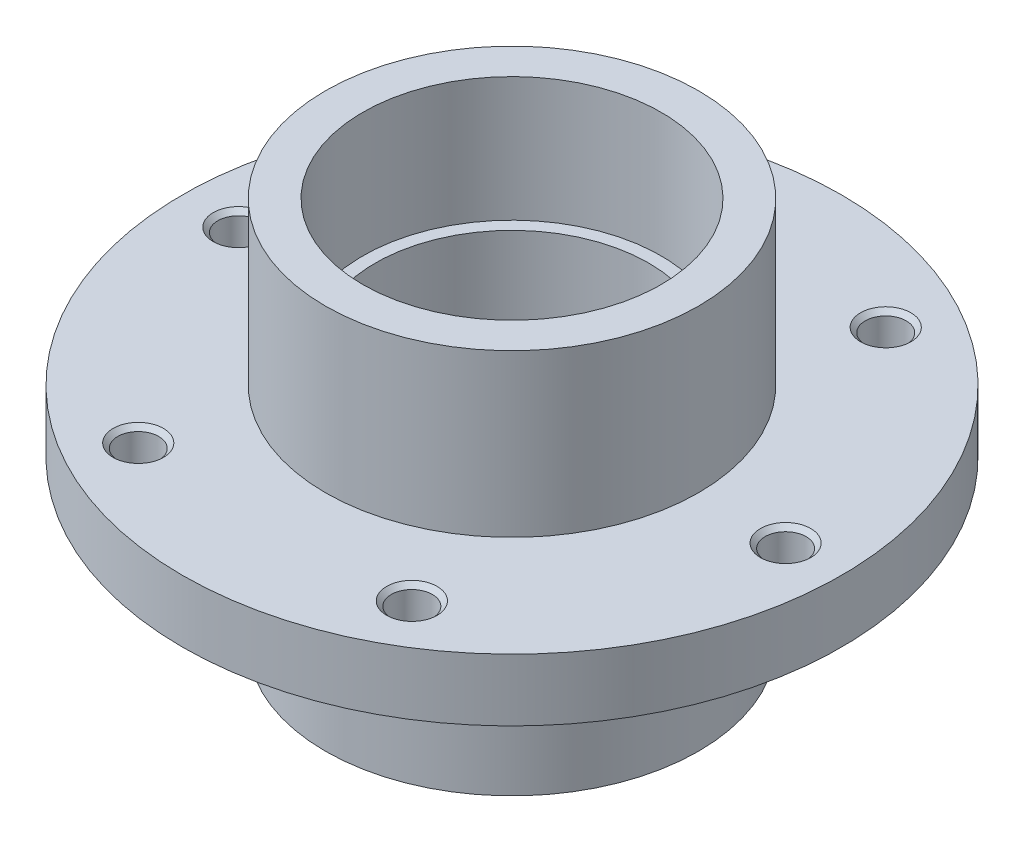
ISO-10303-21;
HEADER;
FILE_DESCRIPTION(('STEP AP214'),'2;1');
FILE_NAME('part.step','',(''),(''),'','','');
FILE_SCHEMA(('AUTOMOTIVE_DESIGN { 1 0 10303 214 1 1 1 1 }'));
ENDSEC;
DATA;
#1=APPLICATION_CONTEXT('core data for automotive mechanical design processes');
#2=APPLICATION_PROTOCOL_DEFINITION('international standard','automotive_design',2000,#1);
#3=PRODUCT_CONTEXT('',#1,'mechanical');
#4=PRODUCT('Part','Part','',(#3));
#5=PRODUCT_RELATED_PRODUCT_CATEGORY('part','',(#4));
#6=PRODUCT_DEFINITION_FORMATION('','',#4);
#7=PRODUCT_DEFINITION_CONTEXT('part definition',#1,'design');
#8=PRODUCT_DEFINITION('design','',#6,#7);
#9=PRODUCT_DEFINITION_SHAPE('','',#8);
#10=(LENGTH_UNIT() NAMED_UNIT(*) SI_UNIT(.MILLI.,.METRE.));
#11=(NAMED_UNIT(*) PLANE_ANGLE_UNIT() SI_UNIT($,.RADIAN.));
#12=(NAMED_UNIT(*) SI_UNIT($,.STERADIAN.) SOLID_ANGLE_UNIT());
#13=UNCERTAINTY_MEASURE_WITH_UNIT(LENGTH_MEASURE(1.E-05),#10,'distance_accuracy_value','');
#14=(GEOMETRIC_REPRESENTATION_CONTEXT(3) GLOBAL_UNCERTAINTY_ASSIGNED_CONTEXT((#13)) GLOBAL_UNIT_ASSIGNED_CONTEXT((#10,
#11,#12)) REPRESENTATION_CONTEXT('',''));
#15=CARTESIAN_POINT('',(0.,0.,0.));
#16=DIRECTION('',(0.,0.,1.));
#17=DIRECTION('',(1.,0.,0.));
#18=AXIS2_PLACEMENT_3D('',#15,#16,#17);
#19=CARTESIAN_POINT('',(0.,-44.1126983722081,0.));
#20=DIRECTION('',(0.,1.,0.));
#21=DIRECTION('',(0.,0.,1.));
#22=AXIS2_PLACEMENT_3D('',#19,#20,#21);
#23=CYLINDRICAL_SURFACE('',#22,11.);
#24=CARTESIAN_POINT('',(0.,8.,0.));
#25=DIRECTION('',(0.,1.,0.));
#26=DIRECTION('',(0.,0.,1.));
#27=AXIS2_PLACEMENT_3D('',#24,#25,#26);
#28=CIRCLE('',#27,11.);
#29=CARTESIAN_POINT('',(0.,8.,11.));
#30=VERTEX_POINT('',#29);
#31=EDGE_CURVE('E63',#30,#30,#28,.F.);
#32=ORIENTED_EDGE('',*,*,#31,.F.);
#33=EDGE_LOOP('',(#32));
#34=FACE_BOUND('',#33,.T.);
#35=CARTESIAN_POINT('',(0.,-3.,0.));
#36=DIRECTION('',(0.,-1.,0.));
#37=DIRECTION('',(0.,0.,-1.));
#38=AXIS2_PLACEMENT_3D('',#35,#36,#37);
#39=CIRCLE('',#38,11.);
#40=CARTESIAN_POINT('',(0.,-3.,-11.));
#41=VERTEX_POINT('',#40);
#42=EDGE_CURVE('E41',#41,#41,#39,.F.);
#43=ORIENTED_EDGE('',*,*,#42,.F.);
#44=EDGE_LOOP('',(#43));
#45=FACE_BOUND('',#44,.T.);
#46=ADVANCED_FACE('F37',(#34,#45),#23,.F.);
#47=CARTESIAN_POINT('',(0.,0.,0.));
#48=DIRECTION('',(0.,1.,0.));
#49=DIRECTION('',(0.,0.,1.));
#50=AXIS2_PLACEMENT_3D('',#47,#48,#49);
#51=PLANE('',#50);
#52=CARTESIAN_POINT('',(-11.0000000000001,0.,-19.0525588832576));
#53=DIRECTION('',(0.,1.,0.));
#54=DIRECTION('',(0.,0.,1.));
#55=AXIS2_PLACEMENT_3D('',#52,#53,#54);
#56=CIRCLE('',#55,1.65);
#57=CARTESIAN_POINT('',(-11.0000000000001,0.,-17.4025588832576));
#58=VERTEX_POINT('',#57);
#59=EDGE_CURVE('E107',#58,#58,#56,.F.);
#60=ORIENTED_EDGE('',*,*,#59,.F.);
#61=EDGE_LOOP('',(#60));
#62=FACE_BOUND('',#61,.T.);
#63=CARTESIAN_POINT('',(11.,0.,-19.0525588832577));
#64=DIRECTION('',(0.,1.,0.));
#65=DIRECTION('',(0.,0.,1.));
#66=AXIS2_PLACEMENT_3D('',#63,#64,#65);
#67=CIRCLE('',#66,1.65);
#68=CARTESIAN_POINT('',(11.,0.,-17.4025588832577));
#69=VERTEX_POINT('',#68);
#70=EDGE_CURVE('E116',#69,#69,#67,.F.);
#71=ORIENTED_EDGE('',*,*,#70,.F.);
#72=EDGE_LOOP('',(#71));
#73=FACE_BOUND('',#72,.T.);
#74=CARTESIAN_POINT('',(22.,0.,0.));
#75=DIRECTION('',(0.,1.,0.));
#76=DIRECTION('',(0.,0.,1.));
#77=AXIS2_PLACEMENT_3D('',#74,#75,#76);
#78=CIRCLE('',#77,1.65);
#79=CARTESIAN_POINT('',(22.,0.,1.65));
#80=VERTEX_POINT('',#79);
#81=EDGE_CURVE('E125',#80,#80,#78,.F.);
#82=ORIENTED_EDGE('',*,*,#81,.F.);
#83=EDGE_LOOP('',(#82));
#84=FACE_BOUND('',#83,.T.);
#85=CARTESIAN_POINT('',(0.,0.,0.));
#86=DIRECTION('',(0.,-1.,0.));
#87=DIRECTION('',(0.,0.,-1.));
#88=AXIS2_PLACEMENT_3D('',#85,#86,#87);
#89=CIRCLE('',#88,15.);
#90=CARTESIAN_POINT('',(0.,0.,15.));
#91=VERTEX_POINT('',#90);
#92=EDGE_CURVE('E10',#91,#91,#89,.T.);
#93=ORIENTED_EDGE('',*,*,#92,.F.);
#94=EDGE_LOOP('',(#93));
#95=FACE_BOUND('',#94,.T.);
#96=CARTESIAN_POINT('',(0.,0.,0.));
#97=DIRECTION('',(0.,1.,0.));
#98=DIRECTION('',(0.,0.,1.));
#99=AXIS2_PLACEMENT_3D('',#96,#97,#98);
#100=CIRCLE('',#99,26.5);
#101=CARTESIAN_POINT('',(0.,0.,26.5));
#102=VERTEX_POINT('',#101);
#103=EDGE_CURVE('E58',#102,#102,#100,.T.);
#104=ORIENTED_EDGE('',*,*,#103,.F.);
#105=EDGE_LOOP('',(#104));
#106=FACE_BOUND('',#105,.T.);
#107=CARTESIAN_POINT('',(-22.,0.,0.));
#108=DIRECTION('',(0.,1.,0.));
#109=DIRECTION('',(0.,0.,1.));
#110=AXIS2_PLACEMENT_3D('',#107,#108,#109);
#111=CIRCLE('',#110,1.65);
#112=CARTESIAN_POINT('',(-22.,0.,1.65));
#113=VERTEX_POINT('',#112);
#114=EDGE_CURVE('E98',#113,#113,#111,.F.);
#115=ORIENTED_EDGE('',*,*,#114,.F.);
#116=EDGE_LOOP('',(#115));
#117=FACE_BOUND('',#116,.T.);
#118=CARTESIAN_POINT('',(-10.9999999999998,0.,19.0525588832577));
#119=DIRECTION('',(0.,1.,0.));
#120=DIRECTION('',(0.,0.,1.));
#121=AXIS2_PLACEMENT_3D('',#118,#119,#120);
#122=CIRCLE('',#121,1.65);
#123=CARTESIAN_POINT('',(-10.9999999999998,0.,20.7025588832577));
#124=VERTEX_POINT('',#123);
#125=EDGE_CURVE('E89',#124,#124,#122,.F.);
#126=ORIENTED_EDGE('',*,*,#125,.F.);
#127=EDGE_LOOP('',(#126));
#128=FACE_BOUND('',#127,.T.);
#129=CARTESIAN_POINT('',(11.0000000000002,0.,19.0525588832575));
#130=DIRECTION('',(0.,1.,0.));
#131=DIRECTION('',(0.,0.,1.));
#132=AXIS2_PLACEMENT_3D('',#129,#130,#131);
#133=CIRCLE('',#132,1.65);
#134=CARTESIAN_POINT('',(11.0000000000002,0.,20.7025588832575));
#135=VERTEX_POINT('',#134);
#136=EDGE_CURVE('E83',#135,#135,#133,.F.);
#137=ORIENTED_EDGE('',*,*,#136,.F.);
#138=EDGE_LOOP('',(#137));
#139=FACE_BOUND('',#138,.T.);
#140=ADVANCED_FACE('F154',(#62,#73,#84,#95,#106,#117,#128,#139),#51,.F.);
#141=CARTESIAN_POINT('',(0.,5.,0.));
#142=DIRECTION('',(0.,-1.,0.));
#143=DIRECTION('',(0.,0.,-1.));
#144=AXIS2_PLACEMENT_3D('',#141,#142,#143);
#145=CYLINDRICAL_SURFACE('',#144,26.5);
#146=CARTESIAN_POINT('',(0.,5.,0.));
#147=DIRECTION('',(0.,1.,0.));
#148=DIRECTION('',(0.,0.,1.));
#149=AXIS2_PLACEMENT_3D('',#146,#147,#148);
#150=CIRCLE('',#149,26.5);
#151=CARTESIAN_POINT('',(0.,5.,26.5));
#152=VERTEX_POINT('',#151);
#153=EDGE_CURVE('E50',#152,#152,#150,.T.);
#154=ORIENTED_EDGE('',*,*,#153,.F.);
#155=EDGE_LOOP('',(#154));
#156=FACE_BOUND('',#155,.T.);
#157=ORIENTED_EDGE('',*,*,#103,.T.);
#158=EDGE_LOOP('',(#157));
#159=FACE_BOUND('',#158,.T.);
#160=ADVANCED_FACE('F39',(#156,#159),#145,.T.);
#161=CARTESIAN_POINT('',(0.,5.,0.));
#162=DIRECTION('',(0.,1.,0.));
#163=DIRECTION('',(0.,0.,1.));
#164=AXIS2_PLACEMENT_3D('',#161,#162,#163);
#165=PLANE('',#164);
#166=CARTESIAN_POINT('',(11.0000000000002,5.,19.0525588832575));
#167=DIRECTION('',(0.,1.,0.));
#168=DIRECTION('',(0.,0.,1.));
#169=AXIS2_PLACEMENT_3D('',#166,#167,#168);
#170=CIRCLE('',#169,2.025);
#171=CARTESIAN_POINT('',(11.0000000000002,5.,21.0775588832575));
#172=VERTEX_POINT('',#171);
#173=EDGE_CURVE('E65',#172,#172,#170,.T.);
#174=ORIENTED_EDGE('',*,*,#173,.F.);
#175=EDGE_LOOP('',(#174));
#176=FACE_BOUND('',#175,.T.);
#177=CARTESIAN_POINT('',(-10.9999999999998,5.,19.0525588832577));
#178=DIRECTION('',(0.,1.,0.));
#179=DIRECTION('',(0.,0.,1.));
#180=AXIS2_PLACEMENT_3D('',#177,#178,#179);
#181=CIRCLE('',#180,2.025);
#182=CARTESIAN_POINT('',(-10.9999999999998,5.,21.0775588832577));
#183=VERTEX_POINT('',#182);
#184=EDGE_CURVE('E85',#183,#183,#181,.T.);
#185=ORIENTED_EDGE('',*,*,#184,.F.);
#186=EDGE_LOOP('',(#185));
#187=FACE_BOUND('',#186,.T.);
#188=CARTESIAN_POINT('',(-22.,5.,0.));
#189=DIRECTION('',(0.,1.,0.));
#190=DIRECTION('',(0.,0.,1.));
#191=AXIS2_PLACEMENT_3D('',#188,#189,#190);
#192=CIRCLE('',#191,2.025);
#193=CARTESIAN_POINT('',(-22.,5.,2.025));
#194=VERTEX_POINT('',#193);
#195=EDGE_CURVE('E92',#194,#194,#192,.T.);
#196=ORIENTED_EDGE('',*,*,#195,.F.);
#197=EDGE_LOOP('',(#196));
#198=FACE_BOUND('',#197,.T.);
#199=CARTESIAN_POINT('',(-11.0000000000001,5.,-19.0525588832576));
#200=DIRECTION('',(0.,1.,0.));
#201=DIRECTION('',(0.,0.,1.));
#202=AXIS2_PLACEMENT_3D('',#199,#200,#201);
#203=CIRCLE('',#202,2.025);
#204=CARTESIAN_POINT('',(-11.0000000000001,5.,-17.0275588832576));
#205=VERTEX_POINT('',#204);
#206=EDGE_CURVE('E101',#205,#205,#203,.T.);
#207=ORIENTED_EDGE('',*,*,#206,.F.);
#208=EDGE_LOOP('',(#207));
#209=FACE_BOUND('',#208,.T.);
#210=CARTESIAN_POINT('',(11.,5.,-19.0525588832577));
#211=DIRECTION('',(0.,1.,0.));
#212=DIRECTION('',(0.,0.,1.));
#213=AXIS2_PLACEMENT_3D('',#210,#211,#212);
#214=CIRCLE('',#213,2.025);
#215=CARTESIAN_POINT('',(11.,5.,-17.0275588832577));
#216=VERTEX_POINT('',#215);
#217=EDGE_CURVE('E110',#216,#216,#214,.T.);
#218=ORIENTED_EDGE('',*,*,#217,.F.);
#219=EDGE_LOOP('',(#218));
#220=FACE_BOUND('',#219,.T.);
#221=CARTESIAN_POINT('',(22.,5.,0.));
#222=DIRECTION('',(0.,1.,0.));
#223=DIRECTION('',(0.,0.,1.));
#224=AXIS2_PLACEMENT_3D('',#221,#222,#223);
#225=CIRCLE('',#224,2.025);
#226=CARTESIAN_POINT('',(22.,5.,2.025));
#227=VERTEX_POINT('',#226);
#228=EDGE_CURVE('E119',#227,#227,#225,.T.);
#229=ORIENTED_EDGE('',*,*,#228,.F.);
#230=EDGE_LOOP('',(#229));
#231=FACE_BOUND('',#230,.T.);
#232=CARTESIAN_POINT('',(0.,5.,0.));
#233=DIRECTION('',(0.,1.,0.));
#234=DIRECTION('',(0.,0.,1.));
#235=AXIS2_PLACEMENT_3D('',#232,#233,#234);
#236=CIRCLE('',#235,15.);
#237=CARTESIAN_POINT('',(0.,5.,-15.));
#238=VERTEX_POINT('',#237);
#239=EDGE_CURVE('E45',#238,#238,#236,.T.);
#240=ORIENTED_EDGE('',*,*,#239,.F.);
#241=EDGE_LOOP('',(#240));
#242=FACE_BOUND('',#241,.T.);
#243=ORIENTED_EDGE('',*,*,#153,.T.);
#244=EDGE_LOOP('',(#243));
#245=FACE_BOUND('',#244,.T.);
#246=ADVANCED_FACE('F142',(#176,#187,#198,#209,#220,#231,#242,#245),#165,.T.);
#247=CARTESIAN_POINT('',(0.,18.,0.));
#248=DIRECTION('',(0.,-1.,0.));
#249=DIRECTION('',(0.,0.,-1.));
#250=AXIS2_PLACEMENT_3D('',#247,#248,#249);
#251=CYLINDRICAL_SURFACE('',#250,15.);
#252=CARTESIAN_POINT('',(0.,18.,0.));
#253=DIRECTION('',(0.,1.,0.));
#254=DIRECTION('',(0.,0.,1.));
#255=AXIS2_PLACEMENT_3D('',#252,#253,#254);
#256=CIRCLE('',#255,15.);
#257=CARTESIAN_POINT('',(0.,18.,-15.));
#258=VERTEX_POINT('',#257);
#259=EDGE_CURVE('E56',#258,#258,#256,.T.);
#260=CARTESIAN_POINT('',(0.,18.,-15.));
#261=CARTESIAN_POINT('',(0.,17.8645833333333,-15.));
#262=CARTESIAN_POINT('',(0.,17.7291666666667,-15.));
#263=CARTESIAN_POINT('',(0.,17.4583333333333,-15.));
#264=CARTESIAN_POINT('',(0.,17.3229166666667,-15.));
#265=CARTESIAN_POINT('',(0.,17.0520833333333,-15.));
#266=CARTESIAN_POINT('',(0.,16.9166666666667,-15.));
#267=CARTESIAN_POINT('',(0.,16.6458333333333,-15.));
#268=CARTESIAN_POINT('',(0.,16.5104166666667,-15.));
#269=CARTESIAN_POINT('',(0.,16.2395833333333,-15.));
#270=CARTESIAN_POINT('',(0.,16.1041666666667,-15.));
#271=CARTESIAN_POINT('',(0.,15.8333333333333,-15.));
#272=CARTESIAN_POINT('',(0.,15.6979166666667,-15.));
#273=CARTESIAN_POINT('',(0.,15.4270833333333,-15.));
#274=CARTESIAN_POINT('',(0.,15.2916666666667,-15.));
#275=CARTESIAN_POINT('',(0.,15.0208333333333,-15.));
#276=CARTESIAN_POINT('',(0.,14.8854166666667,-15.));
#277=CARTESIAN_POINT('',(0.,14.6145833333333,-15.));
#278=CARTESIAN_POINT('',(0.,14.4791666666667,-15.));
#279=CARTESIAN_POINT('',(0.,14.2083333333333,-15.));
#280=CARTESIAN_POINT('',(0.,14.0729166666667,-15.));
#281=CARTESIAN_POINT('',(0.,13.8020833333333,-15.));
#282=CARTESIAN_POINT('',(0.,13.6666666666667,-15.));
#283=CARTESIAN_POINT('',(0.,13.3958333333333,-15.));
#284=CARTESIAN_POINT('',(0.,13.2604166666667,-15.));
#285=CARTESIAN_POINT('',(0.,12.9895833333333,-15.));
#286=CARTESIAN_POINT('',(0.,12.8541666666667,-15.));
#287=CARTESIAN_POINT('',(0.,12.5833333333333,-15.));
#288=CARTESIAN_POINT('',(0.,12.4479166666667,-15.));
#289=CARTESIAN_POINT('',(0.,12.1770833333333,-15.));
#290=CARTESIAN_POINT('',(0.,12.0416666666667,-15.));
#291=CARTESIAN_POINT('',(0.,11.7708333333333,-15.));
#292=CARTESIAN_POINT('',(0.,11.6354166666667,-15.));
#293=CARTESIAN_POINT('',(0.,11.3645833333333,-15.));
#294=CARTESIAN_POINT('',(0.,11.2291666666667,-15.));
#295=CARTESIAN_POINT('',(0.,10.9583333333333,-15.));
#296=CARTESIAN_POINT('',(0.,10.8229166666667,-15.));
#297=CARTESIAN_POINT('',(0.,10.5520833333333,-15.));
#298=CARTESIAN_POINT('',(0.,10.4166666666667,-15.));
#299=CARTESIAN_POINT('',(0.,10.1458333333333,-15.));
#300=CARTESIAN_POINT('',(0.,10.0104166666667,-15.));
#301=CARTESIAN_POINT('',(0.,9.73958333333333,-15.));
#302=CARTESIAN_POINT('',(0.,9.60416666666667,-15.));
#303=CARTESIAN_POINT('',(0.,9.33333333333333,-15.));
#304=CARTESIAN_POINT('',(0.,9.19791666666667,-15.));
#305=CARTESIAN_POINT('',(0.,8.92708333333333,-15.));
#306=CARTESIAN_POINT('',(0.,8.79166666666667,-15.));
#307=CARTESIAN_POINT('',(0.,8.52083333333333,-15.));
#308=CARTESIAN_POINT('',(0.,8.38541666666667,-15.));
#309=CARTESIAN_POINT('',(0.,8.11458333333333,-15.));
#310=CARTESIAN_POINT('',(0.,7.97916666666667,-15.));
#311=CARTESIAN_POINT('',(0.,7.70833333333333,-15.));
#312=CARTESIAN_POINT('',(0.,7.57291666666667,-15.));
#313=CARTESIAN_POINT('',(0.,7.30208333333333,-15.));
#314=CARTESIAN_POINT('',(0.,7.16666666666667,-15.));
#315=CARTESIAN_POINT('',(0.,6.89583333333333,-15.));
#316=CARTESIAN_POINT('',(0.,6.76041666666667,-15.));
#317=CARTESIAN_POINT('',(0.,6.48958333333333,-15.));
#318=CARTESIAN_POINT('',(0.,6.35416666666667,-15.));
#319=CARTESIAN_POINT('',(0.,6.08333333333333,-15.));
#320=CARTESIAN_POINT('',(0.,5.94791666666667,-15.));
#321=CARTESIAN_POINT('',(0.,5.67708333333333,-15.));
#322=CARTESIAN_POINT('',(0.,5.54166666666667,-15.));
#323=CARTESIAN_POINT('',(0.,5.27083333333333,-15.));
#324=CARTESIAN_POINT('',(0.,5.13541666666667,-15.));
#325=CARTESIAN_POINT('',(0.,5.,-15.));
#326=B_SPLINE_CURVE_WITH_KNOTS('',3,(#260,#261,#262,#263,#264,#265,#266,#267,#268,#269,#270,
#271,#272,#273,#274,#275,#276,#277,#278,#279,#280,#281,#282,#283,#284,#285,#286,#287,#288,#289,
#290,#291,#292,#293,#294,#295,#296,#297,#298,#299,#300,#301,#302,#303,#304,#305,#306,#307,#308,
#309,#310,#311,#312,#313,#314,#315,#316,#317,#318,#319,#320,#321,#322,#323,#324,#325),
.UNSPECIFIED.,.F.,.F.,(4,2,2,2,2,2,2,2,2,2,2,2,2,2,2,2,2,2,2,2,2,2,2,2,2,2,2,2,2,2,2,2,4),(0.,
0.40625,0.812500000000001,1.21875,1.625,2.03125,2.4375,2.84375,3.25,3.65625,4.0625,4.46875,
4.875,5.28125,5.6875,6.09375,6.5,6.90625,7.3125,7.71875,8.125,8.53125,8.9375,9.34375,9.75,
10.15625,10.5625,10.96875,11.375,11.78125,12.1875,12.59375,13.),.UNSPECIFIED.);
#327=EDGE_CURVE('BSEAM145',#258,#238,#326,.T.);
#328=ORIENTED_EDGE('',*,*,#259,.F.);
#329=ORIENTED_EDGE('',*,*,#239,.T.);
#330=ORIENTED_EDGE('',*,*,#327,.T.);
#331=ORIENTED_EDGE('',*,*,#327,.F.);
#332=EDGE_LOOP('',(#328,#330,#329,#331));
#333=FACE_BOUND('',#332,.T.);
#334=ADVANCED_FACE('F145',(#333),#251,.T.);
#335=CARTESIAN_POINT('',(0.,18.,0.));
#336=DIRECTION('',(0.,1.,0.));
#337=DIRECTION('',(0.,0.,1.));
#338=AXIS2_PLACEMENT_3D('',#335,#336,#337);
#339=PLANE('',#338);
#340=CARTESIAN_POINT('',(0.,18.,0.));
#341=DIRECTION('',(0.,1.,0.));
#342=DIRECTION('',(0.,0.,1.));
#343=AXIS2_PLACEMENT_3D('',#340,#341,#342);
#344=CIRCLE('',#343,12.);
#345=CARTESIAN_POINT('',(0.,18.,12.));
#346=VERTEX_POINT('',#345);
#347=EDGE_CURVE('E73',#346,#346,#344,.T.);
#348=ORIENTED_EDGE('',*,*,#347,.F.);
#349=EDGE_LOOP('',(#348));
#350=FACE_BOUND('',#349,.T.);
#351=ORIENTED_EDGE('',*,*,#259,.T.);
#352=EDGE_LOOP('',(#351));
#353=FACE_BOUND('',#352,.T.);
#354=ADVANCED_FACE('F328',(#350,#353),#339,.T.);
#355=CARTESIAN_POINT('',(0.,-13.,0.));
#356=DIRECTION('',(0.,1.,0.));
#357=DIRECTION('',(0.,0.,1.));
#358=AXIS2_PLACEMENT_3D('',#355,#356,#357);
#359=CYLINDRICAL_SURFACE('',#358,15.);
#360=CARTESIAN_POINT('',(0.,-13.,0.));
#361=DIRECTION('',(0.,-1.,0.));
#362=DIRECTION('',(0.,0.,-1.));
#363=AXIS2_PLACEMENT_3D('',#360,#361,#362);
#364=CIRCLE('',#363,15.);
#365=CARTESIAN_POINT('',(0.,-13.,15.));
#366=VERTEX_POINT('',#365);
#367=EDGE_CURVE('E54',#366,#366,#364,.T.);
#368=CARTESIAN_POINT('',(0.,-13.,15.));
#369=CARTESIAN_POINT('',(0.,-12.8645833333333,15.));
#370=CARTESIAN_POINT('',(0.,-12.7291666666667,15.));
#371=CARTESIAN_POINT('',(0.,-12.4583333333333,15.));
#372=CARTESIAN_POINT('',(0.,-12.3229166666667,15.));
#373=CARTESIAN_POINT('',(0.,-12.0520833333333,15.));
#374=CARTESIAN_POINT('',(0.,-11.9166666666667,15.));
#375=CARTESIAN_POINT('',(0.,-11.6458333333333,15.));
#376=CARTESIAN_POINT('',(0.,-11.5104166666667,15.));
#377=CARTESIAN_POINT('',(0.,-11.2395833333333,15.));
#378=CARTESIAN_POINT('',(0.,-11.1041666666667,15.));
#379=CARTESIAN_POINT('',(0.,-10.8333333333333,15.));
#380=CARTESIAN_POINT('',(0.,-10.6979166666667,15.));
#381=CARTESIAN_POINT('',(0.,-10.4270833333333,15.));
#382=CARTESIAN_POINT('',(0.,-10.2916666666667,15.));
#383=CARTESIAN_POINT('',(0.,-10.0208333333333,15.));
#384=CARTESIAN_POINT('',(0.,-9.88541666666667,15.));
#385=CARTESIAN_POINT('',(0.,-9.61458333333333,15.));
#386=CARTESIAN_POINT('',(0.,-9.47916666666667,15.));
#387=CARTESIAN_POINT('',(0.,-9.20833333333333,15.));
#388=CARTESIAN_POINT('',(0.,-9.07291666666666,15.));
#389=CARTESIAN_POINT('',(0.,-8.80208333333333,15.));
#390=CARTESIAN_POINT('',(0.,-8.66666666666667,15.));
#391=CARTESIAN_POINT('',(0.,-8.39583333333333,15.));
#392=CARTESIAN_POINT('',(0.,-8.26041666666667,15.));
#393=CARTESIAN_POINT('',(0.,-7.98958333333333,15.));
#394=CARTESIAN_POINT('',(0.,-7.85416666666667,15.));
#395=CARTESIAN_POINT('',(0.,-7.58333333333333,15.));
#396=CARTESIAN_POINT('',(0.,-7.44791666666667,15.));
#397=CARTESIAN_POINT('',(0.,-7.17708333333333,15.));
#398=CARTESIAN_POINT('',(0.,-7.04166666666667,15.));
#399=CARTESIAN_POINT('',(0.,-6.77083333333333,15.));
#400=CARTESIAN_POINT('',(0.,-6.63541666666667,15.));
#401=CARTESIAN_POINT('',(0.,-6.36458333333333,15.));
#402=CARTESIAN_POINT('',(0.,-6.22916666666667,15.));
#403=CARTESIAN_POINT('',(0.,-5.95833333333333,15.));
#404=CARTESIAN_POINT('',(0.,-5.82291666666667,15.));
#405=CARTESIAN_POINT('',(0.,-5.55208333333333,15.));
#406=CARTESIAN_POINT('',(0.,-5.41666666666667,15.));
#407=CARTESIAN_POINT('',(0.,-5.14583333333333,15.));
#408=CARTESIAN_POINT('',(0.,-5.01041666666667,15.));
#409=CARTESIAN_POINT('',(0.,-4.73958333333333,15.));
#410=CARTESIAN_POINT('',(0.,-4.60416666666667,15.));
#411=CARTESIAN_POINT('',(0.,-4.33333333333333,15.));
#412=CARTESIAN_POINT('',(0.,-4.19791666666667,15.));
#413=CARTESIAN_POINT('',(0.,-3.92708333333333,15.));
#414=CARTESIAN_POINT('',(0.,-3.79166666666667,15.));
#415=CARTESIAN_POINT('',(0.,-3.52083333333333,15.));
#416=CARTESIAN_POINT('',(0.,-3.38541666666667,15.));
#417=CARTESIAN_POINT('',(0.,-3.11458333333333,15.));
#418=CARTESIAN_POINT('',(0.,-2.97916666666667,15.));
#419=CARTESIAN_POINT('',(0.,-2.70833333333333,15.));
#420=CARTESIAN_POINT('',(0.,-2.57291666666667,15.));
#421=CARTESIAN_POINT('',(0.,-2.30208333333333,15.));
#422=CARTESIAN_POINT('',(0.,-2.16666666666667,15.));
#423=CARTESIAN_POINT('',(0.,-1.89583333333333,15.));
#424=CARTESIAN_POINT('',(0.,-1.76041666666667,15.));
#425=CARTESIAN_POINT('',(0.,-1.48958333333333,15.));
#426=CARTESIAN_POINT('',(0.,-1.35416666666667,15.));
#427=CARTESIAN_POINT('',(0.,-1.08333333333333,15.));
#428=CARTESIAN_POINT('',(0.,-0.947916666666667,15.));
#429=CARTESIAN_POINT('',(0.,-0.677083333333334,15.));
#430=CARTESIAN_POINT('',(0.,-0.541666666666667,15.));
#431=CARTESIAN_POINT('',(0.,-0.270833333333334,15.));
#432=CARTESIAN_POINT('',(0.,-0.135416666666667,15.));
#433=CARTESIAN_POINT('',(0.,0.,15.));
#434=B_SPLINE_CURVE_WITH_KNOTS('',3,(#368,#369,#370,#371,#372,#373,#374,#375,#376,#377,#378,
#379,#380,#381,#382,#383,#384,#385,#386,#387,#388,#389,#390,#391,#392,#393,#394,#395,#396,#397,
#398,#399,#400,#401,#402,#403,#404,#405,#406,#407,#408,#409,#410,#411,#412,#413,#414,#415,#416,
#417,#418,#419,#420,#421,#422,#423,#424,#425,#426,#427,#428,#429,#430,#431,#432,#433),
.UNSPECIFIED.,.F.,.F.,(4,2,2,2,2,2,2,2,2,2,2,2,2,2,2,2,2,2,2,2,2,2,2,2,2,2,2,2,2,2,2,2,4),(0.,
0.40625,0.812500000000001,1.21875,1.625,2.03125,2.4375,2.84375,3.25,3.65625,4.0625,4.46875,
4.875,5.28125,5.6875,6.09375,6.5,6.90625,7.3125,7.71875,8.125,8.53125,8.9375,9.34375,9.75,
10.15625,10.5625,10.96875,11.375,11.78125,12.1875,12.59375,13.),.UNSPECIFIED.);
#435=EDGE_CURVE('BSEAM322',#366,#91,#434,.T.);
#436=ORIENTED_EDGE('',*,*,#367,.F.);
#437=ORIENTED_EDGE('',*,*,#92,.T.);
#438=ORIENTED_EDGE('',*,*,#435,.T.);
#439=ORIENTED_EDGE('',*,*,#435,.F.);
#440=EDGE_LOOP('',(#436,#438,#437,#439));
#441=FACE_BOUND('',#440,.T.);
#442=ADVANCED_FACE('F322',(#441),#359,.T.);
#443=CARTESIAN_POINT('',(0.,-13.,0.));
#444=DIRECTION('',(0.,-1.,0.));
#445=DIRECTION('',(0.,0.,-1.));
#446=AXIS2_PLACEMENT_3D('',#443,#444,#445);
#447=PLANE('',#446);
#448=CARTESIAN_POINT('',(0.,-13.,0.));
#449=DIRECTION('',(0.,1.,0.));
#450=DIRECTION('',(0.,0.,1.));
#451=AXIS2_PLACEMENT_3D('',#448,#449,#450);
#452=CIRCLE('',#451,12.);
#453=CARTESIAN_POINT('',(0.,-13.,12.));
#454=VERTEX_POINT('',#453);
#455=EDGE_CURVE('E80',#454,#454,#452,.T.);
#456=ORIENTED_EDGE('',*,*,#455,.T.);
#457=EDGE_LOOP('',(#456));
#458=FACE_BOUND('',#457,.T.);
#459=ORIENTED_EDGE('',*,*,#367,.T.);
#460=EDGE_LOOP('',(#459));
#461=FACE_BOUND('',#460,.T.);
#462=ADVANCED_FACE('F320',(#458,#461),#447,.T.);
#463=CARTESIAN_POINT('',(22.,5.,0.));
#464=DIRECTION('',(0.,1.,0.));
#465=DIRECTION('',(0.,0.,1.));
#466=AXIS2_PLACEMENT_3D('',#463,#464,#465);
#467=CYLINDRICAL_SURFACE('',#466,1.65);
#468=ORIENTED_EDGE('',*,*,#81,.T.);
#469=EDGE_LOOP('',(#468));
#470=FACE_BOUND('',#469,.T.);
#471=CARTESIAN_POINT('',(22.,4.625,0.));
#472=DIRECTION('',(0.,1.,0.));
#473=DIRECTION('',(0.,0.,1.));
#474=AXIS2_PLACEMENT_3D('',#471,#472,#473);
#475=CIRCLE('',#474,1.65);
#476=CARTESIAN_POINT('',(22.,4.625,1.65));
#477=VERTEX_POINT('',#476);
#478=EDGE_CURVE('E128',#477,#477,#475,.T.);
#479=ORIENTED_EDGE('',*,*,#478,.T.);
#480=EDGE_LOOP('',(#479));
#481=FACE_BOUND('',#480,.T.);
#482=ADVANCED_FACE('F133',(#470,#481),#467,.F.);
#483=CARTESIAN_POINT('',(22.,5.,0.));
#484=DIRECTION('',(0.,1.,0.));
#485=DIRECTION('',(0.,0.,1.));
#486=AXIS2_PLACEMENT_3D('',#483,#484,#485);
#487=CONICAL_SURFACE('',#486,2.025,0.78539816339745);
#488=ORIENTED_EDGE('',*,*,#478,.F.);
#489=EDGE_LOOP('',(#488));
#490=FACE_BOUND('',#489,.T.);
#491=ORIENTED_EDGE('',*,*,#228,.T.);
#492=EDGE_LOOP('',(#491));
#493=FACE_BOUND('',#492,.T.);
#494=ADVANCED_FACE('F135',(#490,#493),#487,.F.);
#495=CARTESIAN_POINT('',(11.,5.,-19.0525588832577));
#496=DIRECTION('',(0.,1.,0.));
#497=DIRECTION('',(0.,0.,1.));
#498=AXIS2_PLACEMENT_3D('',#495,#496,#497);
#499=CYLINDRICAL_SURFACE('',#498,1.65);
#500=ORIENTED_EDGE('',*,*,#70,.T.);
#501=EDGE_LOOP('',(#500));
#502=FACE_BOUND('',#501,.T.);
#503=CARTESIAN_POINT('',(11.,4.625,-19.0525588832577));
#504=DIRECTION('',(0.,1.,0.));
#505=DIRECTION('',(0.,0.,1.));
#506=AXIS2_PLACEMENT_3D('',#503,#504,#505);
#507=CIRCLE('',#506,1.65);
#508=CARTESIAN_POINT('',(11.,4.625,-17.4025588832577));
#509=VERTEX_POINT('',#508);
#510=EDGE_CURVE('E120',#509,#509,#507,.T.);
#511=ORIENTED_EDGE('',*,*,#510,.T.);
#512=EDGE_LOOP('',(#511));
#513=FACE_BOUND('',#512,.T.);
#514=ADVANCED_FACE('F138',(#502,#513),#499,.F.);
#515=CARTESIAN_POINT('',(11.,5.,-19.0525588832577));
#516=DIRECTION('',(0.,1.,0.));
#517=DIRECTION('',(0.,0.,1.));
#518=AXIS2_PLACEMENT_3D('',#515,#516,#517);
#519=CONICAL_SURFACE('',#518,2.025,0.78539816339745);
#520=ORIENTED_EDGE('',*,*,#510,.F.);
#521=EDGE_LOOP('',(#520));
#522=FACE_BOUND('',#521,.T.);
#523=ORIENTED_EDGE('',*,*,#217,.T.);
#524=EDGE_LOOP('',(#523));
#525=FACE_BOUND('',#524,.T.);
#526=ADVANCED_FACE('F188',(#522,#525),#519,.F.);
#527=CARTESIAN_POINT('',(-11.0000000000001,5.,-19.0525588832576));
#528=DIRECTION('',(0.,1.,0.));
#529=DIRECTION('',(0.,0.,1.));
#530=AXIS2_PLACEMENT_3D('',#527,#528,#529);
#531=CYLINDRICAL_SURFACE('',#530,1.65);
#532=ORIENTED_EDGE('',*,*,#59,.T.);
#533=EDGE_LOOP('',(#532));
#534=FACE_BOUND('',#533,.T.);
#535=CARTESIAN_POINT('',(-11.0000000000001,4.625,-19.0525588832576));
#536=DIRECTION('',(0.,1.,0.));
#537=DIRECTION('',(0.,0.,1.));
#538=AXIS2_PLACEMENT_3D('',#535,#536,#537);
#539=CIRCLE('',#538,1.65);
#540=CARTESIAN_POINT('',(-11.0000000000001,4.625,-17.4025588832576));
#541=VERTEX_POINT('',#540);
#542=EDGE_CURVE('E111',#541,#541,#539,.T.);
#543=ORIENTED_EDGE('',*,*,#542,.T.);
#544=EDGE_LOOP('',(#543));
#545=FACE_BOUND('',#544,.T.);
#546=ADVANCED_FACE('F190',(#534,#545),#531,.F.);
#547=CARTESIAN_POINT('',(-11.0000000000001,5.,-19.0525588832576));
#548=DIRECTION('',(0.,1.,0.));
#549=DIRECTION('',(0.,0.,1.));
#550=AXIS2_PLACEMENT_3D('',#547,#548,#549);
#551=CONICAL_SURFACE('',#550,2.025,0.785398163397452);
#552=ORIENTED_EDGE('',*,*,#542,.F.);
#553=EDGE_LOOP('',(#552));
#554=FACE_BOUND('',#553,.T.);
#555=ORIENTED_EDGE('',*,*,#206,.T.);
#556=EDGE_LOOP('',(#555));
#557=FACE_BOUND('',#556,.T.);
#558=ADVANCED_FACE('F197',(#554,#557),#551,.F.);
#559=CARTESIAN_POINT('',(-22.,5.,0.));
#560=DIRECTION('',(0.,1.,0.));
#561=DIRECTION('',(0.,0.,1.));
#562=AXIS2_PLACEMENT_3D('',#559,#560,#561);
#563=CYLINDRICAL_SURFACE('',#562,1.65);
#564=ORIENTED_EDGE('',*,*,#114,.T.);
#565=EDGE_LOOP('',(#564));
#566=FACE_BOUND('',#565,.T.);
#567=CARTESIAN_POINT('',(-22.,4.625,0.));
#568=DIRECTION('',(0.,1.,0.));
#569=DIRECTION('',(0.,0.,1.));
#570=AXIS2_PLACEMENT_3D('',#567,#568,#569);
#571=CIRCLE('',#570,1.65);
#572=CARTESIAN_POINT('',(-22.,4.625,1.65));
#573=VERTEX_POINT('',#572);
#574=EDGE_CURVE('E102',#573,#573,#571,.T.);
#575=ORIENTED_EDGE('',*,*,#574,.T.);
#576=EDGE_LOOP('',(#575));
#577=FACE_BOUND('',#576,.T.);
#578=ADVANCED_FACE('F225',(#566,#577),#563,.F.);
#579=CARTESIAN_POINT('',(-22.,5.,0.));
#580=DIRECTION('',(0.,1.,0.));
#581=DIRECTION('',(0.,0.,1.));
#582=AXIS2_PLACEMENT_3D('',#579,#580,#581);
#583=CONICAL_SURFACE('',#582,2.025,0.78539816339745);
#584=ORIENTED_EDGE('',*,*,#574,.F.);
#585=EDGE_LOOP('',(#584));
#586=FACE_BOUND('',#585,.T.);
#587=ORIENTED_EDGE('',*,*,#195,.T.);
#588=EDGE_LOOP('',(#587));
#589=FACE_BOUND('',#588,.T.);
#590=ADVANCED_FACE('F221',(#586,#589),#583,.F.);
#591=CARTESIAN_POINT('',(-10.9999999999998,5.,19.0525588832577));
#592=DIRECTION('',(0.,1.,0.));
#593=DIRECTION('',(0.,0.,1.));
#594=AXIS2_PLACEMENT_3D('',#591,#592,#593);
#595=CYLINDRICAL_SURFACE('',#594,1.65);
#596=ORIENTED_EDGE('',*,*,#125,.T.);
#597=EDGE_LOOP('',(#596));
#598=FACE_BOUND('',#597,.T.);
#599=CARTESIAN_POINT('',(-10.9999999999998,4.625,19.0525588832577));
#600=DIRECTION('',(0.,1.,0.));
#601=DIRECTION('',(0.,0.,1.));
#602=AXIS2_PLACEMENT_3D('',#599,#600,#601);
#603=CIRCLE('',#602,1.65);
#604=CARTESIAN_POINT('',(-10.9999999999998,4.625,20.7025588832577));
#605=VERTEX_POINT('',#604);
#606=EDGE_CURVE('E93',#605,#605,#603,.T.);
#607=ORIENTED_EDGE('',*,*,#606,.T.);
#608=EDGE_LOOP('',(#607));
#609=FACE_BOUND('',#608,.T.);
#610=ADVANCED_FACE('F217',(#598,#609),#595,.F.);
#611=CARTESIAN_POINT('',(-10.9999999999998,5.,19.0525588832577));
#612=DIRECTION('',(0.,1.,0.));
#613=DIRECTION('',(0.,0.,1.));
#614=AXIS2_PLACEMENT_3D('',#611,#612,#613);
#615=CONICAL_SURFACE('',#614,2.025,0.785398163397452);
#616=ORIENTED_EDGE('',*,*,#606,.F.);
#617=EDGE_LOOP('',(#616));
#618=FACE_BOUND('',#617,.T.);
#619=ORIENTED_EDGE('',*,*,#184,.T.);
#620=EDGE_LOOP('',(#619));
#621=FACE_BOUND('',#620,.T.);
#622=ADVANCED_FACE('F170',(#618,#621),#615,.F.);
#623=CARTESIAN_POINT('',(11.0000000000002,5.,19.0525588832575));
#624=DIRECTION('',(0.,1.,0.));
#625=DIRECTION('',(0.,0.,1.));
#626=AXIS2_PLACEMENT_3D('',#623,#624,#625);
#627=CYLINDRICAL_SURFACE('',#626,1.65);
#628=ORIENTED_EDGE('',*,*,#136,.T.);
#629=EDGE_LOOP('',(#628));
#630=FACE_BOUND('',#629,.T.);
#631=CARTESIAN_POINT('',(11.0000000000002,4.625,19.0525588832575));
#632=DIRECTION('',(0.,1.,0.));
#633=DIRECTION('',(0.,0.,1.));
#634=AXIS2_PLACEMENT_3D('',#631,#632,#633);
#635=CIRCLE('',#634,1.65);
#636=CARTESIAN_POINT('',(11.0000000000002,4.625,20.7025588832575));
#637=VERTEX_POINT('',#636);
#638=EDGE_CURVE('E70',#637,#637,#635,.T.);
#639=ORIENTED_EDGE('',*,*,#638,.T.);
#640=EDGE_LOOP('',(#639));
#641=FACE_BOUND('',#640,.T.);
#642=ADVANCED_FACE('F166',(#630,#641),#627,.F.);
#643=CARTESIAN_POINT('',(11.0000000000002,5.,19.0525588832575));
#644=DIRECTION('',(0.,1.,0.));
#645=DIRECTION('',(0.,0.,1.));
#646=AXIS2_PLACEMENT_3D('',#643,#644,#645);
#647=CONICAL_SURFACE('',#646,2.025,0.785398163397452);
#648=ORIENTED_EDGE('',*,*,#638,.F.);
#649=EDGE_LOOP('',(#648));
#650=FACE_BOUND('',#649,.T.);
#651=ORIENTED_EDGE('',*,*,#173,.T.);
#652=EDGE_LOOP('',(#651));
#653=FACE_BOUND('',#652,.T.);
#654=ADVANCED_FACE('F169',(#650,#653),#647,.F.);
#655=CARTESIAN_POINT('',(0.,8.,0.));
#656=DIRECTION('',(0.,1.,0.));
#657=DIRECTION('',(0.,0.,1.));
#658=AXIS2_PLACEMENT_3D('',#655,#656,#657);
#659=PLANE('',#658);
#660=CARTESIAN_POINT('',(0.,8.,0.));
#661=DIRECTION('',(0.,1.,0.));
#662=DIRECTION('',(0.,0.,1.));
#663=AXIS2_PLACEMENT_3D('',#660,#661,#662);
#664=CIRCLE('',#663,12.);
#665=CARTESIAN_POINT('',(0.,8.,12.));
#666=VERTEX_POINT('',#665);
#667=EDGE_CURVE('E66',#666,#666,#664,.T.);
#668=ORIENTED_EDGE('',*,*,#667,.T.);
#669=EDGE_LOOP('',(#668));
#670=FACE_BOUND('',#669,.T.);
#671=ORIENTED_EDGE('',*,*,#31,.T.);
#672=EDGE_LOOP('',(#671));
#673=FACE_BOUND('',#672,.T.);
#674=ADVANCED_FACE('F176',(#670,#673),#659,.T.);
#675=CARTESIAN_POINT('',(0.,8.,0.));
#676=DIRECTION('',(0.,1.,0.));
#677=DIRECTION('',(0.,0.,1.));
#678=AXIS2_PLACEMENT_3D('',#675,#676,#677);
#679=CYLINDRICAL_SURFACE('',#678,12.);
#680=ORIENTED_EDGE('',*,*,#667,.F.);
#681=EDGE_LOOP('',(#680));
#682=FACE_BOUND('',#681,.T.);
#683=ORIENTED_EDGE('',*,*,#347,.T.);
#684=EDGE_LOOP('',(#683));
#685=FACE_BOUND('',#684,.T.);
#686=ADVANCED_FACE('F212',(#682,#685),#679,.F.);
#687=CARTESIAN_POINT('',(0.,-3.,0.));
#688=DIRECTION('',(0.,-1.,0.));
#689=DIRECTION('',(0.,0.,1.));
#690=AXIS2_PLACEMENT_3D('',#687,#688,#689);
#691=PLANE('',#690);
#692=CARTESIAN_POINT('',(0.,-3.,0.));
#693=DIRECTION('',(0.,1.,0.));
#694=DIRECTION('',(0.,0.,1.));
#695=AXIS2_PLACEMENT_3D('',#692,#693,#694);
#696=CIRCLE('',#695,12.);
#697=CARTESIAN_POINT('',(0.,-3.,12.));
#698=VERTEX_POINT('',#697);
#699=EDGE_CURVE('E313',#698,#698,#696,.T.);
#700=ORIENTED_EDGE('',*,*,#699,.F.);
#701=EDGE_LOOP('',(#700));
#702=FACE_BOUND('',#701,.T.);
#703=ORIENTED_EDGE('',*,*,#42,.T.);
#704=EDGE_LOOP('',(#703));
#705=FACE_BOUND('',#704,.T.);
#706=ADVANCED_FACE('F284',(#702,#705),#691,.T.);
#707=CARTESIAN_POINT('',(0.,-3.,0.));
#708=DIRECTION('',(0.,-1.,0.));
#709=DIRECTION('',(0.,0.,-1.));
#710=AXIS2_PLACEMENT_3D('',#707,#708,#709);
#711=CYLINDRICAL_SURFACE('',#710,12.);
#712=ORIENTED_EDGE('',*,*,#699,.T.);
#713=EDGE_LOOP('',(#712));
#714=FACE_BOUND('',#713,.T.);
#715=ORIENTED_EDGE('',*,*,#455,.F.);
#716=EDGE_LOOP('',(#715));
#717=FACE_BOUND('',#716,.T.);
#718=ADVANCED_FACE('F296',(#714,#717),#711,.F.);
#719=CLOSED_SHELL('',(#46,#140,#160,#246,#334,#354,#442,#462,#482,#494,#514,#526,#546,#558,#578,
#590,#610,#622,#642,#654,#674,#686,#706,#718));
#720=MANIFOLD_SOLID_BREP('B2',#719);
#721=ADVANCED_BREP_SHAPE_REPRESENTATION('',(#18,#720),#14);
#722=SHAPE_DEFINITION_REPRESENTATION(#9,#721);
ENDSEC;
END-ISO-10303-21;
